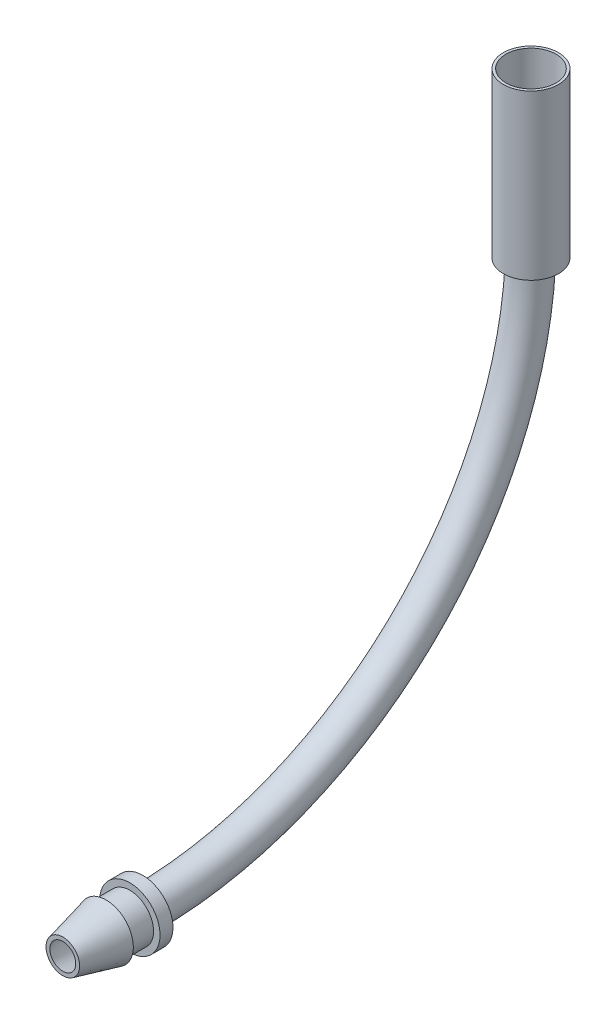
ISO-10303-21;
HEADER;
FILE_DESCRIPTION(('STEP AP214'),'2;1');
FILE_NAME('part.step','',(''),(''),'','','');
FILE_SCHEMA(('AUTOMOTIVE_DESIGN { 1 0 10303 214 1 1 1 1 }'));
ENDSEC;
DATA;
#1=APPLICATION_CONTEXT('core data for automotive mechanical design processes');
#2=APPLICATION_PROTOCOL_DEFINITION('international standard','automotive_design',2000,#1);
#3=PRODUCT_CONTEXT('',#1,'mechanical');
#4=PRODUCT('Part','Part','',(#3));
#5=PRODUCT_RELATED_PRODUCT_CATEGORY('part','',(#4));
#6=PRODUCT_DEFINITION_FORMATION('','',#4);
#7=PRODUCT_DEFINITION_CONTEXT('part definition',#1,'design');
#8=PRODUCT_DEFINITION('design','',#6,#7);
#9=PRODUCT_DEFINITION_SHAPE('','',#8);
#10=(LENGTH_UNIT() NAMED_UNIT(*) SI_UNIT(.MILLI.,.METRE.));
#11=(NAMED_UNIT(*) PLANE_ANGLE_UNIT() SI_UNIT($,.RADIAN.));
#12=(NAMED_UNIT(*) SI_UNIT($,.STERADIAN.) SOLID_ANGLE_UNIT());
#13=UNCERTAINTY_MEASURE_WITH_UNIT(LENGTH_MEASURE(1.E-05),#10,'distance_accuracy_value','');
#14=(GEOMETRIC_REPRESENTATION_CONTEXT(3) GLOBAL_UNCERTAINTY_ASSIGNED_CONTEXT((#13)) GLOBAL_UNIT_ASSIGNED_CONTEXT((#10,
#11,#12)) REPRESENTATION_CONTEXT('',''));
#15=CARTESIAN_POINT('',(0.,0.,0.));
#16=DIRECTION('',(0.,0.,1.));
#17=DIRECTION('',(1.,0.,0.));
#18=AXIS2_PLACEMENT_3D('',#15,#16,#17);
#19=CARTESIAN_POINT('',(0.,1.,-45.));
#20=DIRECTION('',(0.,1.,0.));
#21=DIRECTION('',(0.,0.,1.));
#22=AXIS2_PLACEMENT_3D('',#19,#20,#21);
#23=PLANE('',#22);
#24=CARTESIAN_POINT('',(0.,1.,-45.));
#25=DIRECTION('',(0.,1.,0.));
#26=DIRECTION('',(0.,0.,1.));
#27=AXIS2_PLACEMENT_3D('',#24,#25,#26);
#28=CIRCLE('',#27,1.5);
#29=CARTESIAN_POINT('',(0.,1.,-43.5));
#30=VERTEX_POINT('',#29);
#31=EDGE_CURVE('E51',#30,#30,#28,.T.);
#32=ORIENTED_EDGE('',*,*,#31,.F.);
#33=EDGE_LOOP('',(#32));
#34=FACE_BOUND('',#33,.T.);
#35=CARTESIAN_POINT('',(0.,1.,-45.));
#36=DIRECTION('',(0.,1.,0.));
#37=DIRECTION('',(0.,0.,1.));
#38=AXIS2_PLACEMENT_3D('',#35,#36,#37);
#39=CIRCLE('',#38,2.9);
#40=CARTESIAN_POINT('',(0.,1.,-42.1));
#41=VERTEX_POINT('',#40);
#42=EDGE_CURVE('E43',#41,#41,#39,.T.);
#43=ORIENTED_EDGE('',*,*,#42,.T.);
#44=EDGE_LOOP('',(#43));
#45=FACE_BOUND('',#44,.T.);
#46=ADVANCED_FACE('F39',(#34,#45),#23,.T.);
#47=CARTESIAN_POINT('',(0.,-2.,-45.));
#48=DIRECTION('',(0.,1.,0.));
#49=DIRECTION('',(0.,0.,1.));
#50=AXIS2_PLACEMENT_3D('',#47,#48,#49);
#51=CYLINDRICAL_SURFACE('',#50,3.2);
#52=CARTESIAN_POINT('',(0.,17.,-45.));
#53=DIRECTION('',(0.,1.,0.));
#54=DIRECTION('',(0.,0.,1.));
#55=AXIS2_PLACEMENT_3D('',#52,#53,#54);
#56=CIRCLE('',#55,3.2);
#57=CARTESIAN_POINT('',(0.,17.,-41.8));
#58=VERTEX_POINT('',#57);
#59=EDGE_CURVE('E56',#58,#58,#56,.T.);
#60=ORIENTED_EDGE('',*,*,#59,.F.);
#61=EDGE_LOOP('',(#60));
#62=FACE_BOUND('',#61,.T.);
#63=CARTESIAN_POINT('',(0.,-2.,-45.));
#64=DIRECTION('',(0.,1.,0.));
#65=DIRECTION('',(0.,0.,1.));
#66=AXIS2_PLACEMENT_3D('',#63,#64,#65);
#67=CIRCLE('',#66,3.2);
#68=CARTESIAN_POINT('',(0.,-2.,-41.8));
#69=VERTEX_POINT('',#68);
#70=EDGE_CURVE('E11',#69,#69,#67,.T.);
#71=ORIENTED_EDGE('',*,*,#70,.T.);
#72=EDGE_LOOP('',(#71));
#73=FACE_BOUND('',#72,.T.);
#74=ADVANCED_FACE('F41',(#62,#73),#51,.T.);
#75=CARTESIAN_POINT('',(0.,-2.,-45.));
#76=DIRECTION('',(0.,1.,0.));
#77=DIRECTION('',(0.,0.,1.));
#78=AXIS2_PLACEMENT_3D('',#75,#76,#77);
#79=PLANE('',#78);
#80=CARTESIAN_POINT('',(0.,-2.,-45.));
#81=DIRECTION('',(0.,1.,0.));
#82=DIRECTION('',(0.,0.,1.));
#83=AXIS2_PLACEMENT_3D('',#80,#81,#82);
#84=CIRCLE('',#83,1.5);
#85=CARTESIAN_POINT('',(0.,-2.,-43.5));
#86=VERTEX_POINT('',#85);
#87=EDGE_CURVE('E47',#86,#86,#84,.T.);
#88=ORIENTED_EDGE('',*,*,#87,.T.);
#89=EDGE_LOOP('',(#88));
#90=FACE_BOUND('',#89,.T.);
#91=ORIENTED_EDGE('',*,*,#70,.F.);
#92=EDGE_LOOP('',(#91));
#93=FACE_BOUND('',#92,.T.);
#94=ADVANCED_FACE('F81',(#90,#93),#79,.F.);
#95=CARTESIAN_POINT('',(0.,-2.,-45.));
#96=DIRECTION('',(0.,1.,0.));
#97=DIRECTION('',(0.,0.,1.));
#98=AXIS2_PLACEMENT_3D('',#95,#96,#97);
#99=CYLINDRICAL_SURFACE('',#98,1.5);
#100=ORIENTED_EDGE('',*,*,#87,.F.);
#101=EDGE_LOOP('',(#100));
#102=FACE_BOUND('',#101,.T.);
#103=ORIENTED_EDGE('',*,*,#31,.T.);
#104=EDGE_LOOP('',(#103));
#105=FACE_BOUND('',#104,.T.);
#106=ADVANCED_FACE('F72',(#102,#105),#99,.F.);
#107=CARTESIAN_POINT('',(0.,0.,-45.));
#108=DIRECTION('',(0.,1.,0.));
#109=DIRECTION('',(0.,0.,1.));
#110=AXIS2_PLACEMENT_3D('',#107,#108,#109);
#111=CYLINDRICAL_SURFACE('',#110,2.9);
#112=ORIENTED_EDGE('',*,*,#42,.F.);
#113=EDGE_LOOP('',(#112));
#114=FACE_BOUND('',#113,.T.);
#115=CARTESIAN_POINT('',(0.,17.,-45.));
#116=DIRECTION('',(0.,1.,0.));
#117=DIRECTION('',(0.,0.,1.));
#118=AXIS2_PLACEMENT_3D('',#115,#116,#117);
#119=CIRCLE('',#118,2.9);
#120=CARTESIAN_POINT('',(0.,17.,-42.1));
#121=VERTEX_POINT('',#120);
#122=EDGE_CURVE('E59',#121,#121,#119,.T.);
#123=ORIENTED_EDGE('',*,*,#122,.T.);
#124=EDGE_LOOP('',(#123));
#125=FACE_BOUND('',#124,.T.);
#126=ADVANCED_FACE('F63',(#114,#125),#111,.F.);
#127=CARTESIAN_POINT('',(0.,17.,-45.));
#128=DIRECTION('',(0.,1.,0.));
#129=DIRECTION('',(0.,0.,1.));
#130=AXIS2_PLACEMENT_3D('',#127,#128,#129);
#131=PLANE('',#130);
#132=ORIENTED_EDGE('',*,*,#59,.T.);
#133=EDGE_LOOP('',(#132));
#134=FACE_BOUND('',#133,.T.);
#135=ORIENTED_EDGE('',*,*,#122,.F.);
#136=EDGE_LOOP('',(#135));
#137=FACE_BOUND('',#136,.T.);
#138=ADVANCED_FACE('F65',(#134,#137),#131,.T.);
#139=CLOSED_SHELL('',(#46,#74,#94,#106,#126,#138));
#140=MANIFOLD_SOLID_BREP('B2',#139);
#141=CARTESIAN_POINT('',(0.,-45.,4.5));
#142=DIRECTION('',(0.,0.,1.));
#143=DIRECTION('',(1.,0.,0.));
#144=AXIS2_PLACEMENT_3D('',#141,#142,#143);
#145=PLANE('',#144);
#146=CARTESIAN_POINT('',(0.,-45.,4.5));
#147=DIRECTION('',(0.,0.,1.));
#148=DIRECTION('',(1.,0.,0.));
#149=AXIS2_PLACEMENT_3D('',#146,#147,#148);
#150=CIRCLE('',#149,1.5);
#151=CARTESIAN_POINT('',(1.5,-45.,4.5));
#152=VERTEX_POINT('',#151);
#153=EDGE_CURVE('E160',#152,#152,#150,.T.);
#154=ORIENTED_EDGE('',*,*,#153,.F.);
#155=EDGE_LOOP('',(#154));
#156=FACE_BOUND('',#155,.T.);
#157=CARTESIAN_POINT('',(0.,-45.,4.5));
#158=DIRECTION('',(0.,0.,1.));
#159=DIRECTION('',(1.,0.,0.));
#160=AXIS2_PLACEMENT_3D('',#157,#158,#159);
#161=CIRCLE('',#160,2.59327026622904);
#162=CARTESIAN_POINT('',(2.59327026622904,-45.,4.5));
#163=VERTEX_POINT('',#162);
#164=EDGE_CURVE('E38',#163,#163,#161,.F.);
#165=ORIENTED_EDGE('',*,*,#164,.F.);
#166=EDGE_LOOP('',(#165));
#167=FACE_BOUND('',#166,.T.);
#168=ADVANCED_FACE('F134',(#156,#167),#145,.T.);
#169=CARTESIAN_POINT('',(0.,-45.,4.5));
#170=DIRECTION('',(0.,0.,-1.));
#171=DIRECTION('',(-1.,0.,0.));
#172=AXIS2_PLACEMENT_3D('',#169,#170,#171);
#173=CYLINDRICAL_SURFACE('',#172,2.75);
#174=CARTESIAN_POINT('',(0.,-45.,4.25711996010329));
#175=DIRECTION('',(0.,0.,-1.));
#176=DIRECTION('',(-1.,0.,0.));
#177=AXIS2_PLACEMENT_3D('',#174,#175,#176);
#178=CIRCLE('',#177,2.75);
#179=CARTESIAN_POINT('',(-2.75,-45.,4.25711996010329));
#180=VERTEX_POINT('',#179);
#181=EDGE_CURVE('E138',#180,#180,#178,.T.);
#182=ORIENTED_EDGE('',*,*,#181,.T.);
#183=EDGE_LOOP('',(#182));
#184=FACE_BOUND('',#183,.T.);
#185=CARTESIAN_POINT('',(0.,-45.,1.5));
#186=DIRECTION('',(0.,0.,-1.));
#187=DIRECTION('',(0.,1.,0.));
#188=AXIS2_PLACEMENT_3D('',#185,#186,#187);
#189=CIRCLE('',#188,2.75);
#190=CARTESIAN_POINT('',(0.,-42.25,1.5));
#191=VERTEX_POINT('',#190);
#192=EDGE_CURVE('E142',#191,#191,#189,.T.);
#193=ORIENTED_EDGE('',*,*,#192,.F.);
#194=EDGE_LOOP('',(#193));
#195=FACE_BOUND('',#194,.T.);
#196=ADVANCED_FACE('F198',(#184,#195),#173,.T.);
#197=CARTESIAN_POINT('',(0.,0.,-45.));
#198=DIRECTION('',(0.,1.,0.));
#199=DIRECTION('',(0.,0.,1.));
#200=AXIS2_PLACEMENT_3D('',#197,#198,#199);
#201=PLANE('',#200);
#202=CARTESIAN_POINT('',(0.,0.,-45.));
#203=DIRECTION('',(0.,1.,0.));
#204=DIRECTION('',(0.,0.,1.));
#205=AXIS2_PLACEMENT_3D('',#202,#203,#204);
#206=CIRCLE('',#205,1.5);
#207=CARTESIAN_POINT('',(0.,0.,-46.5));
#208=VERTEX_POINT('',#207);
#209=EDGE_CURVE('E151',#208,#208,#206,.T.);
#210=ORIENTED_EDGE('',*,*,#209,.F.);
#211=EDGE_LOOP('',(#210));
#212=FACE_BOUND('',#211,.T.);
#213=CARTESIAN_POINT('',(0.,0.,-45.));
#214=DIRECTION('',(0.,1.,0.));
#215=DIRECTION('',(0.,0.,1.));
#216=AXIS2_PLACEMENT_3D('',#213,#214,#215);
#217=CIRCLE('',#216,2.07);
#218=CARTESIAN_POINT('',(0.,0.,-47.07));
#219=VERTEX_POINT('',#218);
#220=EDGE_CURVE('E146',#219,#219,#217,.T.);
#221=ORIENTED_EDGE('',*,*,#220,.T.);
#222=EDGE_LOOP('',(#221));
#223=FACE_BOUND('',#222,.T.);
#224=ADVANCED_FACE('F204',(#212,#223),#201,.T.);
#225=CARTESIAN_POINT('',(0.,0.,0.));
#226=DIRECTION('',(1.,0.,0.));
#227=DIRECTION('',(0.,0.,-1.));
#228=AXIS2_PLACEMENT_3D('',#225,#226,#227);
#229=TOROIDAL_SURFACE('',#228,45.,2.07);
#230=CARTESIAN_POINT('',(0.,-45.,0.));
#231=DIRECTION('',(0.,0.,1.));
#232=DIRECTION('',(1.,0.,0.));
#233=AXIS2_PLACEMENT_3D('',#230,#231,#232);
#234=CIRCLE('',#233,2.07);
#235=CARTESIAN_POINT('',(0.,-47.07,0.));
#236=VERTEX_POINT('',#235);
#237=EDGE_CURVE('E157',#236,#236,#234,.F.);
#238=CARTESIAN_POINT('',(0.,0.,0.));
#239=DIRECTION('',(1.,0.,0.));
#240=DIRECTION('',(0.,0.,-1.));
#241=AXIS2_PLACEMENT_3D('',#238,#239,#240);
#242=CIRCLE('',#241,47.07);
#243=EDGE_CURVE('',#236,#219,#242,.T.);
#244=ORIENTED_EDGE('',*,*,#237,.T.);
#245=ORIENTED_EDGE('',*,*,#220,.F.);
#246=ORIENTED_EDGE('',*,*,#243,.T.);
#247=ORIENTED_EDGE('',*,*,#243,.F.);
#248=EDGE_LOOP('',(#244,#246,#245,#247));
#249=FACE_BOUND('',#248,.T.);
#250=ADVANCED_FACE('F136',(#249),#229,.T.);
#251=CARTESIAN_POINT('',(0.,0.,0.));
#252=DIRECTION('',(1.,0.,0.));
#253=DIRECTION('',(0.,0.,-1.));
#254=AXIS2_PLACEMENT_3D('',#251,#252,#253);
#255=TOROIDAL_SURFACE('',#254,45.,1.5);
#256=CARTESIAN_POINT('',(0.,-45.,0.));
#257=DIRECTION('',(0.,0.,-1.));
#258=DIRECTION('',(0.,1.,0.));
#259=AXIS2_PLACEMENT_3D('',#256,#257,#258);
#260=CIRCLE('',#259,1.5);
#261=CARTESIAN_POINT('',(0.,-46.5,0.));
#262=VERTEX_POINT('',#261);
#263=EDGE_CURVE('E154',#262,#262,#260,.T.);
#264=CARTESIAN_POINT('',(0.,0.,0.));
#265=DIRECTION('',(1.,0.,0.));
#266=DIRECTION('',(0.,0.,-1.));
#267=AXIS2_PLACEMENT_3D('',#264,#265,#266);
#268=CIRCLE('',#267,46.5);
#269=EDGE_CURVE('',#262,#208,#268,.T.);
#270=ORIENTED_EDGE('',*,*,#263,.F.);
#271=ORIENTED_EDGE('',*,*,#209,.T.);
#272=ORIENTED_EDGE('',*,*,#269,.T.);
#273=ORIENTED_EDGE('',*,*,#269,.F.);
#274=EDGE_LOOP('',(#270,#272,#271,#273));
#275=FACE_BOUND('',#274,.T.);
#276=ADVANCED_FACE('F215',(#275),#255,.F.);
#277=CARTESIAN_POINT('',(0.,-45.,0.));
#278=DIRECTION('',(0.,0.,1.));
#279=DIRECTION('',(1.,0.,0.));
#280=AXIS2_PLACEMENT_3D('',#277,#278,#279);
#281=PLANE('',#280);
#282=CARTESIAN_POINT('',(0.,-45.,0.));
#283=DIRECTION('',(0.,0.,-1.));
#284=DIRECTION('',(0.,1.,0.));
#285=AXIS2_PLACEMENT_3D('',#282,#283,#284);
#286=CIRCLE('',#285,3.5);
#287=CARTESIAN_POINT('',(0.,-41.5,0.));
#288=VERTEX_POINT('',#287);
#289=EDGE_CURVE('E164',#288,#288,#286,.T.);
#290=ORIENTED_EDGE('',*,*,#289,.T.);
#291=EDGE_LOOP('',(#290));
#292=FACE_BOUND('',#291,.T.);
#293=ORIENTED_EDGE('',*,*,#237,.F.);
#294=EDGE_LOOP('',(#293));
#295=FACE_BOUND('',#294,.T.);
#296=ADVANCED_FACE('F213',(#292,#295),#281,.F.);
#297=CARTESIAN_POINT('',(0.,-45.,4.5));
#298=DIRECTION('',(0.,0.,-1.));
#299=DIRECTION('',(-1.,0.,0.));
#300=AXIS2_PLACEMENT_3D('',#297,#298,#299);
#301=CYLINDRICAL_SURFACE('',#300,1.5);
#302=ORIENTED_EDGE('',*,*,#153,.T.);
#303=EDGE_LOOP('',(#302));
#304=FACE_BOUND('',#303,.T.);
#305=ORIENTED_EDGE('',*,*,#263,.T.);
#306=EDGE_LOOP('',(#305));
#307=FACE_BOUND('',#306,.T.);
#308=ADVANCED_FACE('F211',(#304,#307),#301,.F.);
#309=CARTESIAN_POINT('',(0.,-45.,1.5));
#310=DIRECTION('',(0.,0.,-1.));
#311=DIRECTION('',(0.,1.,0.));
#312=AXIS2_PLACEMENT_3D('',#309,#310,#311);
#313=CYLINDRICAL_SURFACE('',#312,3.5);
#314=CARTESIAN_POINT('',(0.,-45.,1.5));
#315=DIRECTION('',(0.,0.,-1.));
#316=DIRECTION('',(0.,1.,0.));
#317=AXIS2_PLACEMENT_3D('',#314,#315,#316);
#318=CIRCLE('',#317,3.5);
#319=CARTESIAN_POINT('',(0.,-41.5,1.5));
#320=VERTEX_POINT('',#319);
#321=EDGE_CURVE('E163',#320,#320,#318,.T.);
#322=ORIENTED_EDGE('',*,*,#321,.T.);
#323=EDGE_LOOP('',(#322));
#324=FACE_BOUND('',#323,.T.);
#325=ORIENTED_EDGE('',*,*,#289,.F.);
#326=EDGE_LOOP('',(#325));
#327=FACE_BOUND('',#326,.T.);
#328=ADVANCED_FACE('F194',(#324,#327),#313,.T.);
#329=CARTESIAN_POINT('',(0.,-45.,1.5));
#330=DIRECTION('',(0.,0.,-1.));
#331=DIRECTION('',(0.,1.,0.));
#332=AXIS2_PLACEMENT_3D('',#329,#330,#331);
#333=PLANE('',#332);
#334=ORIENTED_EDGE('',*,*,#192,.T.);
#335=EDGE_LOOP('',(#334));
#336=FACE_BOUND('',#335,.T.);
#337=ORIENTED_EDGE('',*,*,#321,.F.);
#338=EDGE_LOOP('',(#337));
#339=FACE_BOUND('',#338,.T.);
#340=ADVANCED_FACE('F185',(#336,#339),#333,.F.);
#341=CARTESIAN_POINT('',(0.,-45.,9.27148168675335));
#342=DIRECTION('',(0.,0.,-1.));
#343=DIRECTION('',(-1.,0.,0.));
#344=AXIS2_PLACEMENT_3D('',#341,#342,#343);
#345=CONICAL_SURFACE('',#344,1.5,0.225238092216142);
#346=ORIENTED_EDGE('',*,*,#164,.T.);
#347=EDGE_LOOP('',(#346));
#348=FACE_BOUND('',#347,.T.);
#349=CARTESIAN_POINT('',(0.,-45.,9.27148168675335));
#350=DIRECTION('',(0.,0.,-1.));
#351=DIRECTION('',(-1.,0.,0.));
#352=AXIS2_PLACEMENT_3D('',#349,#350,#351);
#353=CIRCLE('',#352,1.5);
#354=CARTESIAN_POINT('',(-1.5,-45.,9.27148168675335));
#355=VERTEX_POINT('',#354);
#356=EDGE_CURVE('E175',#355,#355,#353,.T.);
#357=ORIENTED_EDGE('',*,*,#356,.F.);
#358=EDGE_LOOP('',(#357));
#359=FACE_BOUND('',#358,.T.);
#360=ADVANCED_FACE('F182',(#348,#359),#345,.F.);
#361=CARTESIAN_POINT('',(0.,-42.3510796143087,4.25711996010329));
#362=DIRECTION('',(0.,0.,-1.));
#363=DIRECTION('',(-1.,0.,0.));
#364=AXIS2_PLACEMENT_3D('',#361,#362,#363);
#365=PLANE('',#364);
#366=ORIENTED_EDGE('',*,*,#181,.F.);
#367=EDGE_LOOP('',(#366));
#368=FACE_BOUND('',#367,.T.);
#369=CARTESIAN_POINT('',(0.,-45.,4.25711996010329));
#370=DIRECTION('',(0.,0.,-1.));
#371=DIRECTION('',(-1.,0.,0.));
#372=AXIS2_PLACEMENT_3D('',#369,#370,#371);
#373=CIRCLE('',#372,3.16187718216151);
#374=CARTESIAN_POINT('',(-3.16187718216151,-45.,4.25711996010329));
#375=VERTEX_POINT('',#374);
#376=EDGE_CURVE('E169',#375,#375,#373,.T.);
#377=ORIENTED_EDGE('',*,*,#376,.T.);
#378=EDGE_LOOP('',(#377));
#379=FACE_BOUND('',#378,.T.);
#380=ADVANCED_FACE('F184',(#368,#379),#365,.T.);
#381=CARTESIAN_POINT('',(0.,-45.,4.25711996010329));
#382=DIRECTION('',(0.,0.,-1.));
#383=DIRECTION('',(-1.,0.,0.));
#384=AXIS2_PLACEMENT_3D('',#381,#382,#383);
#385=CONICAL_SURFACE('',#384,3.16187718216151,0.237716524545852);
#386=CARTESIAN_POINT('',(0.,-45.,9.27148168675335));
#387=DIRECTION('',(0.,0.,-1.));
#388=DIRECTION('',(-1.,0.,0.));
#389=AXIS2_PLACEMENT_3D('',#386,#387,#388);
#390=CIRCLE('',#389,1.94690823741617);
#391=CARTESIAN_POINT('',(-1.94690823741617,-45.,9.27148168675335));
#392=VERTEX_POINT('',#391);
#393=EDGE_CURVE('E172',#392,#392,#390,.T.);
#394=ORIENTED_EDGE('',*,*,#393,.T.);
#395=EDGE_LOOP('',(#394));
#396=FACE_BOUND('',#395,.T.);
#397=ORIENTED_EDGE('',*,*,#376,.F.);
#398=EDGE_LOOP('',(#397));
#399=FACE_BOUND('',#398,.T.);
#400=ADVANCED_FACE('F191',(#396,#399),#385,.T.);
#401=CARTESIAN_POINT('',(0.,-43.0530917625838,9.27148168675335));
#402=DIRECTION('',(0.,0.,1.));
#403=DIRECTION('',(1.,0.,0.));
#404=AXIS2_PLACEMENT_3D('',#401,#402,#403);
#405=PLANE('',#404);
#406=ORIENTED_EDGE('',*,*,#356,.T.);
#407=EDGE_LOOP('',(#406));
#408=FACE_BOUND('',#407,.T.);
#409=ORIENTED_EDGE('',*,*,#393,.F.);
#410=EDGE_LOOP('',(#409));
#411=FACE_BOUND('',#410,.T.);
#412=ADVANCED_FACE('F179',(#408,#411),#405,.T.);
#413=CLOSED_SHELL('',(#168,#196,#224,#250,#276,#296,#308,#328,#340,#360,#380,#400,#412));
#414=MANIFOLD_SOLID_BREP('B6',#413);
#415=ADVANCED_BREP_SHAPE_REPRESENTATION('',(#18,#140,#414),#14);
#416=SHAPE_DEFINITION_REPRESENTATION(#9,#415);
ENDSEC;
END-ISO-10303-21;
